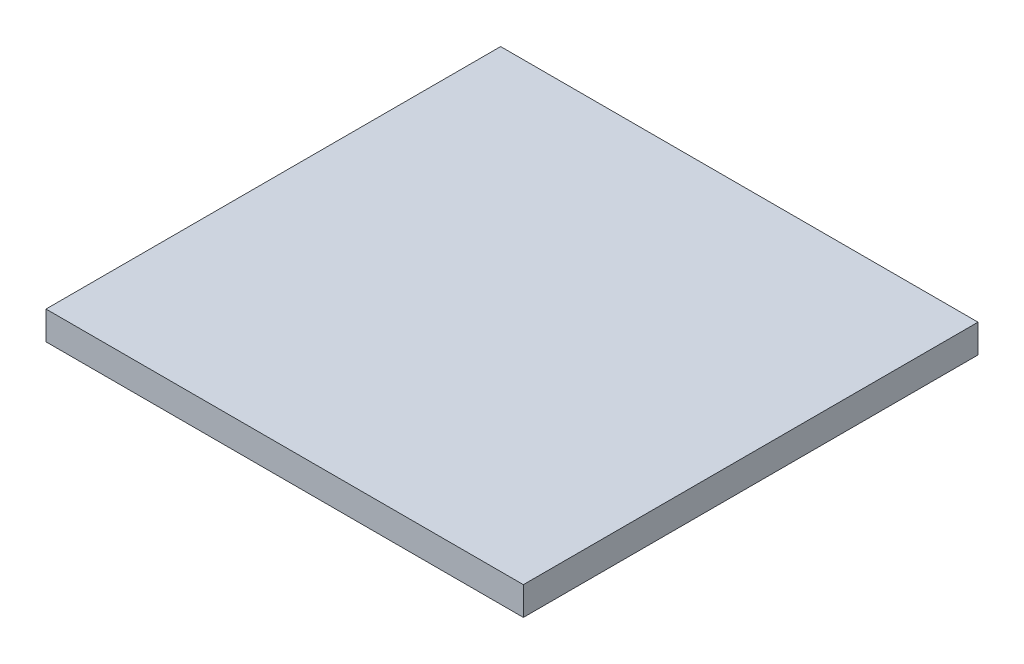
ISO-10303-21;
HEADER;
FILE_DESCRIPTION(('STEP AP214'),'2;1');
FILE_NAME('part.step','',(''),(''),'','','');
FILE_SCHEMA(('AUTOMOTIVE_DESIGN { 1 0 10303 214 1 1 1 1 }'));
ENDSEC;
DATA;
#1=APPLICATION_CONTEXT('core data for automotive mechanical design processes');
#2=APPLICATION_PROTOCOL_DEFINITION('international standard','automotive_design',2000,#1);
#3=PRODUCT_CONTEXT('',#1,'mechanical');
#4=PRODUCT('Part','Part','',(#3));
#5=PRODUCT_RELATED_PRODUCT_CATEGORY('part','',(#4));
#6=PRODUCT_DEFINITION_FORMATION('','',#4);
#7=PRODUCT_DEFINITION_CONTEXT('part definition',#1,'design');
#8=PRODUCT_DEFINITION('design','',#6,#7);
#9=PRODUCT_DEFINITION_SHAPE('','',#8);
#10=(LENGTH_UNIT() NAMED_UNIT(*) SI_UNIT(.MILLI.,.METRE.));
#11=(NAMED_UNIT(*) PLANE_ANGLE_UNIT() SI_UNIT($,.RADIAN.));
#12=(NAMED_UNIT(*) SI_UNIT($,.STERADIAN.) SOLID_ANGLE_UNIT());
#13=UNCERTAINTY_MEASURE_WITH_UNIT(LENGTH_MEASURE(1.E-05),#10,'distance_accuracy_value','');
#14=(GEOMETRIC_REPRESENTATION_CONTEXT(3) GLOBAL_UNCERTAINTY_ASSIGNED_CONTEXT((#13)) GLOBAL_UNIT_ASSIGNED_CONTEXT((#10,
#11,#12)) REPRESENTATION_CONTEXT('',''));
#15=CARTESIAN_POINT('',(0.,0.,0.));
#16=DIRECTION('',(0.,0.,1.));
#17=DIRECTION('',(1.,0.,0.));
#18=AXIS2_PLACEMENT_3D('',#15,#16,#17);
#19=CARTESIAN_POINT('',(0.,3.175,0.));
#20=DIRECTION('',(1.,0.,0.));
#21=DIRECTION('',(0.,0.,-1.));
#22=AXIS2_PLACEMENT_3D('',#19,#20,#21);
#23=PLANE('',#22);
#24=DIRECTION('',(0.,0.,1.));
#25=VECTOR('',#24,1.);
#26=CARTESIAN_POINT('',(0.,0.,0.));
#27=LINE('',#26,#25);
#28=CARTESIAN_POINT('',(0.,0.,-50.8));
#29=VERTEX_POINT('',#28);
#30=CARTESIAN_POINT('',(0.,0.,0.));
#31=VERTEX_POINT('',#30);
#32=EDGE_CURVE('E104',#29,#31,#27,.T.);
#33=ORIENTED_EDGE('',*,*,#32,.T.);
#34=DIRECTION('',(0.,-1.,0.));
#35=VECTOR('',#34,1.);
#36=CARTESIAN_POINT('',(0.,3.175,0.));
#37=LINE('',#36,#35);
#38=CARTESIAN_POINT('',(0.,3.175,0.));
#39=VERTEX_POINT('',#38);
#40=EDGE_CURVE('E11',#39,#31,#37,.T.);
#41=ORIENTED_EDGE('',*,*,#40,.F.);
#42=DIRECTION('',(0.,0.,1.));
#43=VECTOR('',#42,1.);
#44=CARTESIAN_POINT('',(0.,3.175,0.));
#45=LINE('',#44,#43);
#46=CARTESIAN_POINT('',(0.,3.175,-50.8));
#47=VERTEX_POINT('',#46);
#48=EDGE_CURVE('E92',#47,#39,#45,.T.);
#49=ORIENTED_EDGE('',*,*,#48,.F.);
#50=DIRECTION('',(0.,-1.,0.));
#51=VECTOR('',#50,1.);
#52=CARTESIAN_POINT('',(0.,3.175,-50.8));
#53=LINE('',#52,#51);
#54=EDGE_CURVE('E100',#47,#29,#53,.T.);
#55=ORIENTED_EDGE('',*,*,#54,.T.);
#56=EDGE_LOOP('',(#33,#41,#49,#55));
#57=FACE_BOUND('',#56,.T.);
#58=ADVANCED_FACE('F41',(#57),#23,.F.);
#59=CARTESIAN_POINT('',(0.,3.175,0.));
#60=DIRECTION('',(0.,0.,-1.));
#61=DIRECTION('',(-1.,0.,0.));
#62=AXIS2_PLACEMENT_3D('',#59,#60,#61);
#63=PLANE('',#62);
#64=DIRECTION('',(1.,0.,0.));
#65=VECTOR('',#64,1.);
#66=CARTESIAN_POINT('',(0.,0.,0.));
#67=LINE('',#66,#65);
#68=CARTESIAN_POINT('',(53.34,0.,0.));
#69=VERTEX_POINT('',#68);
#70=EDGE_CURVE('E96',#31,#69,#67,.T.);
#71=ORIENTED_EDGE('',*,*,#70,.T.);
#72=DIRECTION('',(0.,-1.,0.));
#73=VECTOR('',#72,1.);
#74=CARTESIAN_POINT('',(53.34,3.175,0.));
#75=LINE('',#74,#73);
#76=CARTESIAN_POINT('',(53.34,3.175,0.));
#77=VERTEX_POINT('',#76);
#78=EDGE_CURVE('E49',#77,#69,#75,.T.);
#79=ORIENTED_EDGE('',*,*,#78,.F.);
#80=DIRECTION('',(1.,0.,0.));
#81=VECTOR('',#80,1.);
#82=CARTESIAN_POINT('',(0.,3.175,0.));
#83=LINE('',#82,#81);
#84=EDGE_CURVE('E87',#39,#77,#83,.T.);
#85=ORIENTED_EDGE('',*,*,#84,.F.);
#86=ORIENTED_EDGE('',*,*,#40,.T.);
#87=EDGE_LOOP('',(#71,#79,#85,#86));
#88=FACE_BOUND('',#87,.T.);
#89=ADVANCED_FACE('F95',(#88),#63,.F.);
#90=CARTESIAN_POINT('',(53.34,3.175,0.));
#91=DIRECTION('',(-1.,0.,0.));
#92=DIRECTION('',(0.,0.,1.));
#93=AXIS2_PLACEMENT_3D('',#90,#91,#92);
#94=PLANE('',#93);
#95=DIRECTION('',(0.,0.,-1.));
#96=VECTOR('',#95,1.);
#97=CARTESIAN_POINT('',(53.34,0.,0.));
#98=LINE('',#97,#96);
#99=CARTESIAN_POINT('',(53.34,0.,-50.8));
#100=VERTEX_POINT('',#99);
#101=EDGE_CURVE('E74',#69,#100,#98,.T.);
#102=ORIENTED_EDGE('',*,*,#101,.T.);
#103=DIRECTION('',(0.,-1.,0.));
#104=VECTOR('',#103,1.);
#105=CARTESIAN_POINT('',(53.34,3.175,-50.8));
#106=LINE('',#105,#104);
#107=CARTESIAN_POINT('',(53.34,3.175,-50.8));
#108=VERTEX_POINT('',#107);
#109=EDGE_CURVE('E97',#108,#100,#106,.T.);
#110=ORIENTED_EDGE('',*,*,#109,.F.);
#111=DIRECTION('',(0.,0.,-1.));
#112=VECTOR('',#111,1.);
#113=CARTESIAN_POINT('',(53.34,3.175,0.));
#114=LINE('',#113,#112);
#115=EDGE_CURVE('E90',#77,#108,#114,.T.);
#116=ORIENTED_EDGE('',*,*,#115,.F.);
#117=ORIENTED_EDGE('',*,*,#78,.T.);
#118=EDGE_LOOP('',(#102,#110,#116,#117));
#119=FACE_BOUND('',#118,.T.);
#120=ADVANCED_FACE('F98',(#119),#94,.F.);
#121=CARTESIAN_POINT('',(0.,3.175,-50.8));
#122=DIRECTION('',(0.,0.,1.));
#123=DIRECTION('',(1.,0.,0.));
#124=AXIS2_PLACEMENT_3D('',#121,#122,#123);
#125=PLANE('',#124);
#126=DIRECTION('',(-1.,0.,0.));
#127=VECTOR('',#126,1.);
#128=CARTESIAN_POINT('',(0.,0.,-50.8));
#129=LINE('',#128,#127);
#130=EDGE_CURVE('E80',#100,#29,#129,.T.);
#131=ORIENTED_EDGE('',*,*,#130,.T.);
#132=ORIENTED_EDGE('',*,*,#54,.F.);
#133=DIRECTION('',(-1.,0.,0.));
#134=VECTOR('',#133,1.);
#135=CARTESIAN_POINT('',(0.,3.175,-50.8));
#136=LINE('',#135,#134);
#137=EDGE_CURVE('E57',#108,#47,#136,.T.);
#138=ORIENTED_EDGE('',*,*,#137,.F.);
#139=ORIENTED_EDGE('',*,*,#109,.T.);
#140=EDGE_LOOP('',(#131,#132,#138,#139));
#141=FACE_BOUND('',#140,.T.);
#142=ADVANCED_FACE('F111',(#141),#125,.F.);
#143=CARTESIAN_POINT('',(0.,3.175,0.));
#144=DIRECTION('',(0.,-1.,0.));
#145=DIRECTION('',(0.,0.,-1.));
#146=AXIS2_PLACEMENT_3D('',#143,#144,#145);
#147=PLANE('',#146);
#148=ORIENTED_EDGE('',*,*,#48,.T.);
#149=ORIENTED_EDGE('',*,*,#84,.T.);
#150=ORIENTED_EDGE('',*,*,#115,.T.);
#151=ORIENTED_EDGE('',*,*,#137,.T.);
#152=EDGE_LOOP('',(#148,#149,#150,#151));
#153=FACE_BOUND('',#152,.T.);
#154=ADVANCED_FACE('F88',(#153),#147,.F.);
#155=CARTESIAN_POINT('',(0.,0.,0.));
#156=DIRECTION('',(0.,-1.,0.));
#157=DIRECTION('',(0.,0.,-1.));
#158=AXIS2_PLACEMENT_3D('',#155,#156,#157);
#159=PLANE('',#158);
#160=ORIENTED_EDGE('',*,*,#32,.F.);
#161=ORIENTED_EDGE('',*,*,#130,.F.);
#162=ORIENTED_EDGE('',*,*,#101,.F.);
#163=ORIENTED_EDGE('',*,*,#70,.F.);
#164=EDGE_LOOP('',(#160,#161,#162,#163));
#165=FACE_BOUND('',#164,.T.);
#166=ADVANCED_FACE('F114',(#165),#159,.T.);
#167=CLOSED_SHELL('',(#58,#89,#120,#142,#154,#166));
#168=MANIFOLD_SOLID_BREP('B2',#167);
#169=ADVANCED_BREP_SHAPE_REPRESENTATION('',(#18,#168),#14);
#170=SHAPE_DEFINITION_REPRESENTATION(#9,#169);
ENDSEC;
END-ISO-10303-21;
